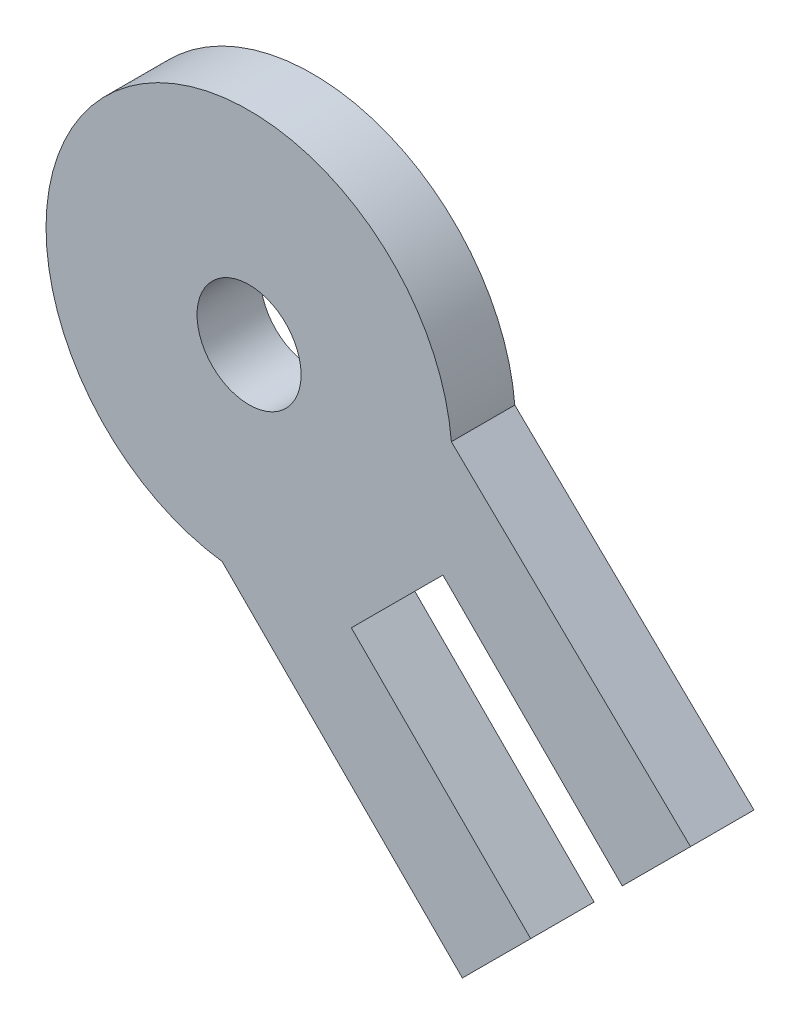
ISO-10303-21;
HEADER;
FILE_DESCRIPTION(('STEP AP214'),'2;1');
FILE_NAME('part.step','',(''),(''),'','','');
FILE_SCHEMA(('AUTOMOTIVE_DESIGN { 1 0 10303 214 1 1 1 1 }'));
ENDSEC;
DATA;
#1=APPLICATION_CONTEXT('core data for automotive mechanical design processes');
#2=APPLICATION_PROTOCOL_DEFINITION('international standard','automotive_design',2000,#1);
#3=PRODUCT_CONTEXT('',#1,'mechanical');
#4=PRODUCT('Part','Part','',(#3));
#5=PRODUCT_RELATED_PRODUCT_CATEGORY('part','',(#4));
#6=PRODUCT_DEFINITION_FORMATION('','',#4);
#7=PRODUCT_DEFINITION_CONTEXT('part definition',#1,'design');
#8=PRODUCT_DEFINITION('design','',#6,#7);
#9=PRODUCT_DEFINITION_SHAPE('','',#8);
#10=(LENGTH_UNIT() NAMED_UNIT(*) SI_UNIT(.MILLI.,.METRE.));
#11=(NAMED_UNIT(*) PLANE_ANGLE_UNIT() SI_UNIT($,.RADIAN.));
#12=(NAMED_UNIT(*) SI_UNIT($,.STERADIAN.) SOLID_ANGLE_UNIT());
#13=UNCERTAINTY_MEASURE_WITH_UNIT(LENGTH_MEASURE(1.E-05),#10,'distance_accuracy_value','');
#14=(GEOMETRIC_REPRESENTATION_CONTEXT(3) GLOBAL_UNCERTAINTY_ASSIGNED_CONTEXT((#13)) GLOBAL_UNIT_ASSIGNED_CONTEXT((#10,
#11,#12)) REPRESENTATION_CONTEXT('',''));
#15=CARTESIAN_POINT('',(0.,0.,0.));
#16=DIRECTION('',(0.,0.,1.));
#17=DIRECTION('',(1.,0.,0.));
#18=AXIS2_PLACEMENT_3D('',#15,#16,#17);
#19=CARTESIAN_POINT('',(76.2174841840645,468.70525092052,5.));
#20=DIRECTION('',(0.,0.,-1.));
#21=DIRECTION('',(-1.,0.,0.));
#22=AXIS2_PLACEMENT_3D('',#19,#20,#21);
#23=CYLINDRICAL_SURFACE('',#22,16.);
#24=CARTESIAN_POINT('',(76.2174841840645,468.70525092052,0.));
#25=DIRECTION('',(0.,0.,1.));
#26=DIRECTION('',(1.,0.,0.));
#27=AXIS2_PLACEMENT_3D('',#24,#25,#26);
#28=CIRCLE('',#27,16.);
#29=CARTESIAN_POINT('',(92.160301492897,470.056759802175,0.));
#30=VERTEX_POINT('',#29);
#31=CARTESIAN_POINT('',(74.0997063717039,452.846025935122,0.));
#32=VERTEX_POINT('',#31);
#33=EDGE_CURVE('E182',#30,#32,#28,.T.);
#34=ORIENTED_EDGE('',*,*,#33,.T.);
#35=DIRECTION('',(0.,0.,-1.));
#36=VECTOR('',#35,1.);
#37=CARTESIAN_POINT('',(74.0997063717039,452.846025935122,5.));
#38=LINE('',#37,#36);
#39=CARTESIAN_POINT('',(74.0997063717039,452.846025935122,5.));
#40=VERTEX_POINT('',#39);
#41=EDGE_CURVE('E13',#40,#32,#38,.T.);
#42=ORIENTED_EDGE('',*,*,#41,.F.);
#43=CARTESIAN_POINT('',(76.2174841840645,468.70525092052,5.));
#44=DIRECTION('',(0.,0.,1.));
#45=DIRECTION('',(1.,0.,0.));
#46=AXIS2_PLACEMENT_3D('',#43,#44,#45);
#47=CIRCLE('',#46,16.);
#48=CARTESIAN_POINT('',(92.160301492897,470.056759802175,5.));
#49=VERTEX_POINT('',#48);
#50=EDGE_CURVE('E174',#49,#40,#47,.T.);
#51=ORIENTED_EDGE('',*,*,#50,.F.);
#52=DIRECTION('',(0.,0.,-1.));
#53=VECTOR('',#52,1.);
#54=CARTESIAN_POINT('',(92.160301492897,470.056759802175,5.));
#55=LINE('',#54,#53);
#56=EDGE_CURVE('E152',#49,#30,#55,.T.);
#57=ORIENTED_EDGE('',*,*,#56,.T.);
#58=EDGE_LOOP('',(#34,#42,#51,#57));
#59=FACE_BOUND('',#58,.T.);
#60=ADVANCED_FACE('F60',(#59),#23,.T.);
#61=CARTESIAN_POINT('',(74.0997063717039,452.846025935122,5.));
#62=DIRECTION('',(0.707601655881524,0.706611559906661,0.));
#63=DIRECTION('',(-0.706611559906662,0.707601655881524,0.));
#64=AXIS2_PLACEMENT_3D('',#61,#62,#63);
#65=PLANE('',#64);
#66=DIRECTION('',(0.706611559906661,-0.707601655881524,0.));
#67=VECTOR('',#66,1.);
#68=CARTESIAN_POINT('',(74.0997063717039,452.846025935122,0.));
#69=LINE('',#68,#67);
#70=CARTESIAN_POINT('',(93.0288732991489,433.890335677115,0.));
#71=VERTEX_POINT('',#70);
#72=EDGE_CURVE('E186',#32,#71,#69,.T.);
#73=ORIENTED_EDGE('',*,*,#72,.T.);
#74=DIRECTION('',(0.,0.,-1.));
#75=VECTOR('',#74,1.);
#76=CARTESIAN_POINT('',(93.0288732991489,433.890335677115,5.));
#77=LINE('',#76,#75);
#78=CARTESIAN_POINT('',(93.0288732991489,433.890335677115,5.));
#79=VERTEX_POINT('',#78);
#80=EDGE_CURVE('E68',#79,#71,#77,.T.);
#81=ORIENTED_EDGE('',*,*,#80,.F.);
#82=DIRECTION('',(0.706611559906661,-0.707601655881524,0.));
#83=VECTOR('',#82,1.);
#84=CARTESIAN_POINT('',(74.0997063717039,452.846025935122,5.));
#85=LINE('',#84,#83);
#86=EDGE_CURVE('E119',#40,#79,#85,.T.);
#87=ORIENTED_EDGE('',*,*,#86,.F.);
#88=ORIENTED_EDGE('',*,*,#41,.T.);
#89=EDGE_LOOP('',(#73,#81,#87,#88));
#90=FACE_BOUND('',#89,.T.);
#91=ADVANCED_FACE('F234',(#90),#65,.F.);
#92=CARTESIAN_POINT('',(93.0288732991489,433.890335677115,5.));
#93=DIRECTION('',(-0.706611559906661,0.707601655881525,0.));
#94=DIRECTION('',(-0.707601655881525,-0.706611559906661,0.));
#95=AXIS2_PLACEMENT_3D('',#92,#93,#94);
#96=PLANE('',#95);
#97=DIRECTION('',(0.707601655881525,0.706611559906661,0.));
#98=VECTOR('',#97,1.);
#99=CARTESIAN_POINT('',(93.0288732991489,433.890335677115,0.));
#100=LINE('',#99,#98);
#101=CARTESIAN_POINT('',(98.4100811432059,439.264013985052,0.));
#102=VERTEX_POINT('',#101);
#103=EDGE_CURVE('E190',#71,#102,#100,.T.);
#104=ORIENTED_EDGE('',*,*,#103,.T.);
#105=DIRECTION('',(0.,0.,-1.));
#106=VECTOR('',#105,1.);
#107=CARTESIAN_POINT('',(98.4100811432059,439.264013985052,5.));
#108=LINE('',#107,#106);
#109=CARTESIAN_POINT('',(98.4100811432059,439.264013985052,5.));
#110=VERTEX_POINT('',#109);
#111=EDGE_CURVE('E207',#110,#102,#108,.T.);
#112=ORIENTED_EDGE('',*,*,#111,.F.);
#113=DIRECTION('',(0.707601655881525,0.706611559906661,0.));
#114=VECTOR('',#113,1.);
#115=CARTESIAN_POINT('',(93.0288732991489,433.890335677115,5.));
#116=LINE('',#115,#114);
#117=EDGE_CURVE('E167',#79,#110,#116,.T.);
#118=ORIENTED_EDGE('',*,*,#117,.F.);
#119=ORIENTED_EDGE('',*,*,#80,.T.);
#120=EDGE_LOOP('',(#104,#112,#118,#119));
#121=FACE_BOUND('',#120,.T.);
#122=ADVANCED_FACE('F213',(#121),#96,.F.);
#123=CARTESIAN_POINT('',(98.4100811432059,439.264013985052,5.));
#124=DIRECTION('',(-0.70760165588153,-0.706611559906655,0.));
#125=DIRECTION('',(0.706611559906655,-0.70760165588153,0.));
#126=AXIS2_PLACEMENT_3D('',#123,#124,#125);
#127=PLANE('',#126);
#128=DIRECTION('',(-0.706611559906655,0.70760165588153,0.));
#129=VECTOR('',#128,1.);
#130=CARTESIAN_POINT('',(98.4100811432059,439.264013985052,0.));
#131=LINE('',#130,#129);
#132=CARTESIAN_POINT('',(84.2778499450728,453.416047102683,0.));
#133=VERTEX_POINT('',#132);
#134=EDGE_CURVE('E194',#102,#133,#131,.T.);
#135=ORIENTED_EDGE('',*,*,#134,.T.);
#136=DIRECTION('',(0.,0.,-1.));
#137=VECTOR('',#136,1.);
#138=CARTESIAN_POINT('',(84.2778499450728,453.416047102683,5.));
#139=LINE('',#138,#137);
#140=CARTESIAN_POINT('',(84.2778499450728,453.416047102683,5.));
#141=VERTEX_POINT('',#140);
#142=EDGE_CURVE('E204',#141,#133,#139,.T.);
#143=ORIENTED_EDGE('',*,*,#142,.F.);
#144=DIRECTION('',(-0.706611559906655,0.70760165588153,0.));
#145=VECTOR('',#144,1.);
#146=CARTESIAN_POINT('',(98.4100811432059,439.264013985052,5.));
#147=LINE('',#146,#145);
#148=EDGE_CURVE('E164',#110,#141,#147,.T.);
#149=ORIENTED_EDGE('',*,*,#148,.F.);
#150=ORIENTED_EDGE('',*,*,#111,.T.);
#151=EDGE_LOOP('',(#135,#143,#149,#150));
#152=FACE_BOUND('',#151,.T.);
#153=ADVANCED_FACE('F221',(#152),#127,.F.);
#154=CARTESIAN_POINT('',(84.2778499450728,453.416047102683,5.));
#155=DIRECTION('',(-0.706611559906661,0.707601655881524,0.));
#156=DIRECTION('',(-0.707601655881524,-0.706611559906661,0.));
#157=AXIS2_PLACEMENT_3D('',#154,#155,#156);
#158=PLANE('',#157);
#159=DIRECTION('',(0.707601655881524,0.706611559906661,0.));
#160=VECTOR('',#159,1.);
#161=CARTESIAN_POINT('',(84.2778499450728,453.416047102683,0.));
#162=LINE('',#161,#160);
#163=CARTESIAN_POINT('',(91.4953868350644,460.623485013731,0.));
#164=VERTEX_POINT('',#163);
#165=EDGE_CURVE('E196',#133,#164,#162,.T.);
#166=ORIENTED_EDGE('',*,*,#165,.T.);
#167=DIRECTION('',(0.,0.,-1.));
#168=VECTOR('',#167,1.);
#169=CARTESIAN_POINT('',(91.4953868350644,460.623485013731,5.));
#170=LINE('',#169,#168);
#171=CARTESIAN_POINT('',(91.4953868350644,460.623485013731,5.));
#172=VERTEX_POINT('',#171);
#173=EDGE_CURVE('E147',#172,#164,#170,.T.);
#174=ORIENTED_EDGE('',*,*,#173,.F.);
#175=DIRECTION('',(0.707601655881524,0.706611559906661,0.));
#176=VECTOR('',#175,1.);
#177=CARTESIAN_POINT('',(84.2778499450728,453.416047102683,5.));
#178=LINE('',#177,#176);
#179=EDGE_CURVE('E138',#141,#172,#178,.T.);
#180=ORIENTED_EDGE('',*,*,#179,.F.);
#181=ORIENTED_EDGE('',*,*,#142,.T.);
#182=EDGE_LOOP('',(#166,#174,#180,#181));
#183=FACE_BOUND('',#182,.T.);
#184=ADVANCED_FACE('F224',(#183),#158,.F.);
#185=CARTESIAN_POINT('',(91.4953868350644,460.623485013731,5.));
#186=DIRECTION('',(0.707601655881524,0.706611559906661,0.));
#187=DIRECTION('',(-0.706611559906661,0.707601655881524,0.));
#188=AXIS2_PLACEMENT_3D('',#185,#186,#187);
#189=PLANE('',#188);
#190=DIRECTION('',(0.706611559906661,-0.707601655881524,0.));
#191=VECTOR('',#190,1.);
#192=CARTESIAN_POINT('',(91.4953868350644,460.623485013731,0.));
#193=LINE('',#192,#191);
#194=CARTESIAN_POINT('',(105.627618033198,446.471451896101,0.));
#195=VERTEX_POINT('',#194);
#196=EDGE_CURVE('E146',#164,#195,#193,.T.);
#197=ORIENTED_EDGE('',*,*,#196,.T.);
#198=DIRECTION('',(0.,0.,-1.));
#199=VECTOR('',#198,1.);
#200=CARTESIAN_POINT('',(105.627618033198,446.471451896101,5.));
#201=LINE('',#200,#199);
#202=CARTESIAN_POINT('',(105.627618033198,446.471451896101,5.));
#203=VERTEX_POINT('',#202);
#204=EDGE_CURVE('E143',#203,#195,#201,.T.);
#205=ORIENTED_EDGE('',*,*,#204,.F.);
#206=DIRECTION('',(0.706611559906661,-0.707601655881524,0.));
#207=VECTOR('',#206,1.);
#208=CARTESIAN_POINT('',(91.4953868350644,460.623485013731,5.));
#209=LINE('',#208,#207);
#210=EDGE_CURVE('E132',#172,#203,#209,.T.);
#211=ORIENTED_EDGE('',*,*,#210,.F.);
#212=ORIENTED_EDGE('',*,*,#173,.T.);
#213=EDGE_LOOP('',(#197,#205,#211,#212));
#214=FACE_BOUND('',#213,.T.);
#215=ADVANCED_FACE('F144',(#214),#189,.F.);
#216=CARTESIAN_POINT('',(105.627618033198,446.471451896101,5.));
#217=DIRECTION('',(-0.706611559906663,0.707601655881523,0.));
#218=DIRECTION('',(-0.707601655881523,-0.706611559906663,0.));
#219=AXIS2_PLACEMENT_3D('',#216,#217,#218);
#220=PLANE('',#219);
#221=DIRECTION('',(0.707601655881523,0.706611559906663,0.));
#222=VECTOR('',#221,1.);
#223=CARTESIAN_POINT('',(105.627618033198,446.471451896101,0.));
#224=LINE('',#223,#222);
#225=CARTESIAN_POINT('',(111.008825877255,451.845130204038,0.));
#226=VERTEX_POINT('',#225);
#227=EDGE_CURVE('E105',#195,#226,#224,.T.);
#228=ORIENTED_EDGE('',*,*,#227,.T.);
#229=DIRECTION('',(0.,0.,-1.));
#230=VECTOR('',#229,1.);
#231=CARTESIAN_POINT('',(111.008825877255,451.845130204038,5.));
#232=LINE('',#231,#230);
#233=CARTESIAN_POINT('',(111.008825877255,451.845130204038,5.));
#234=VERTEX_POINT('',#233);
#235=EDGE_CURVE('E148',#234,#226,#232,.T.);
#236=ORIENTED_EDGE('',*,*,#235,.F.);
#237=DIRECTION('',(0.707601655881523,0.706611559906663,0.));
#238=VECTOR('',#237,1.);
#239=CARTESIAN_POINT('',(105.627618033198,446.471451896101,5.));
#240=LINE('',#239,#238);
#241=EDGE_CURVE('E136',#203,#234,#240,.T.);
#242=ORIENTED_EDGE('',*,*,#241,.F.);
#243=ORIENTED_EDGE('',*,*,#204,.T.);
#244=EDGE_LOOP('',(#228,#236,#242,#243));
#245=FACE_BOUND('',#244,.T.);
#246=ADVANCED_FACE('F150',(#245),#220,.F.);
#247=CARTESIAN_POINT('',(111.008825877255,451.845130204038,5.));
#248=DIRECTION('',(-0.694852244164912,-0.719152528173951,0.));
#249=DIRECTION('',(0.719152528173951,-0.694852244164912,0.));
#250=AXIS2_PLACEMENT_3D('',#247,#248,#249);
#251=PLANE('',#250);
#252=DIRECTION('',(-0.719152528173951,0.694852244164912,0.));
#253=VECTOR('',#252,1.);
#254=CARTESIAN_POINT('',(111.008825877255,451.845130204038,0.));
#255=LINE('',#254,#253);
#256=EDGE_CURVE('E111',#226,#30,#255,.T.);
#257=ORIENTED_EDGE('',*,*,#256,.T.);
#258=ORIENTED_EDGE('',*,*,#56,.F.);
#259=DIRECTION('',(-0.719152528173951,0.694852244164912,0.));
#260=VECTOR('',#259,1.);
#261=CARTESIAN_POINT('',(111.008825877255,451.845130204038,5.));
#262=LINE('',#261,#260);
#263=EDGE_CURVE('E76',#234,#49,#262,.T.);
#264=ORIENTED_EDGE('',*,*,#263,.F.);
#265=ORIENTED_EDGE('',*,*,#235,.T.);
#266=EDGE_LOOP('',(#257,#258,#264,#265));
#267=FACE_BOUND('',#266,.T.);
#268=ADVANCED_FACE('F243',(#267),#251,.F.);
#269=CARTESIAN_POINT('',(76.2174841840645,468.70525092052,5.));
#270=DIRECTION('',(0.,0.,1.));
#271=DIRECTION('',(1.,0.,0.));
#272=AXIS2_PLACEMENT_3D('',#269,#270,#271);
#273=PLANE('',#272);
#274=CARTESIAN_POINT('',(76.2174841840608,468.705250920519,5.));
#275=DIRECTION('',(0.,0.,1.));
#276=DIRECTION('',(1.,0.,0.));
#277=AXIS2_PLACEMENT_3D('',#274,#275,#276);
#278=CIRCLE('',#277,4.09999999999745);
#279=CARTESIAN_POINT('',(80.3174841840583,468.705250920519,5.));
#280=VERTEX_POINT('',#279);
#281=EDGE_CURVE('E180',#280,#280,#278,.F.);
#282=ORIENTED_EDGE('',*,*,#281,.T.);
#283=EDGE_LOOP('',(#282));
#284=FACE_BOUND('',#283,.T.);
#285=ORIENTED_EDGE('',*,*,#50,.T.);
#286=ORIENTED_EDGE('',*,*,#86,.T.);
#287=ORIENTED_EDGE('',*,*,#117,.T.);
#288=ORIENTED_EDGE('',*,*,#148,.T.);
#289=ORIENTED_EDGE('',*,*,#179,.T.);
#290=ORIENTED_EDGE('',*,*,#210,.T.);
#291=ORIENTED_EDGE('',*,*,#241,.T.);
#292=ORIENTED_EDGE('',*,*,#263,.T.);
#293=EDGE_LOOP('',(#285,#286,#287,#288,#289,#290,#291,#292));
#294=FACE_BOUND('',#293,.T.);
#295=ADVANCED_FACE('F134',(#284,#294),#273,.T.);
#296=CARTESIAN_POINT('',(76.2174841840645,468.70525092052,0.));
#297=DIRECTION('',(0.,0.,1.));
#298=DIRECTION('',(1.,0.,0.));
#299=AXIS2_PLACEMENT_3D('',#296,#297,#298);
#300=PLANE('',#299);
#301=CARTESIAN_POINT('',(76.2174841840608,468.705250920519,0.));
#302=DIRECTION('',(0.,0.,1.));
#303=DIRECTION('',(1.,0.,0.));
#304=AXIS2_PLACEMENT_3D('',#301,#302,#303);
#305=CIRCLE('',#304,4.09999999999745);
#306=CARTESIAN_POINT('',(80.3174841840583,468.705250920519,0.));
#307=VERTEX_POINT('',#306);
#308=EDGE_CURVE('E177',#307,#307,#305,.F.);
#309=ORIENTED_EDGE('',*,*,#308,.F.);
#310=EDGE_LOOP('',(#309));
#311=FACE_BOUND('',#310,.T.);
#312=ORIENTED_EDGE('',*,*,#33,.F.);
#313=ORIENTED_EDGE('',*,*,#256,.F.);
#314=ORIENTED_EDGE('',*,*,#227,.F.);
#315=ORIENTED_EDGE('',*,*,#196,.F.);
#316=ORIENTED_EDGE('',*,*,#165,.F.);
#317=ORIENTED_EDGE('',*,*,#134,.F.);
#318=ORIENTED_EDGE('',*,*,#103,.F.);
#319=ORIENTED_EDGE('',*,*,#72,.F.);
#320=EDGE_LOOP('',(#312,#313,#314,#315,#316,#317,#318,#319));
#321=FACE_BOUND('',#320,.T.);
#322=ADVANCED_FACE('F217',(#311,#321),#300,.F.);
#323=CARTESIAN_POINT('',(76.2174841840608,468.705250920519,5.));
#324=DIRECTION('',(0.,0.,-1.));
#325=DIRECTION('',(-1.,0.,0.));
#326=AXIS2_PLACEMENT_3D('',#323,#324,#325);
#327=CYLINDRICAL_SURFACE('',#326,4.09999999999745);
#328=ORIENTED_EDGE('',*,*,#281,.F.);
#329=EDGE_LOOP('',(#328));
#330=FACE_BOUND('',#329,.T.);
#331=ORIENTED_EDGE('',*,*,#308,.T.);
#332=EDGE_LOOP('',(#331));
#333=FACE_BOUND('',#332,.T.);
#334=ADVANCED_FACE('F254',(#330,#333),#327,.F.);
#335=CLOSED_SHELL('',(#60,#91,#122,#153,#184,#215,#246,#268,#295,#322,#334));
#336=MANIFOLD_SOLID_BREP('B2',#335);
#337=ADVANCED_BREP_SHAPE_REPRESENTATION('',(#18,#336),#14);
#338=SHAPE_DEFINITION_REPRESENTATION(#9,#337);
ENDSEC;
END-ISO-10303-21;
